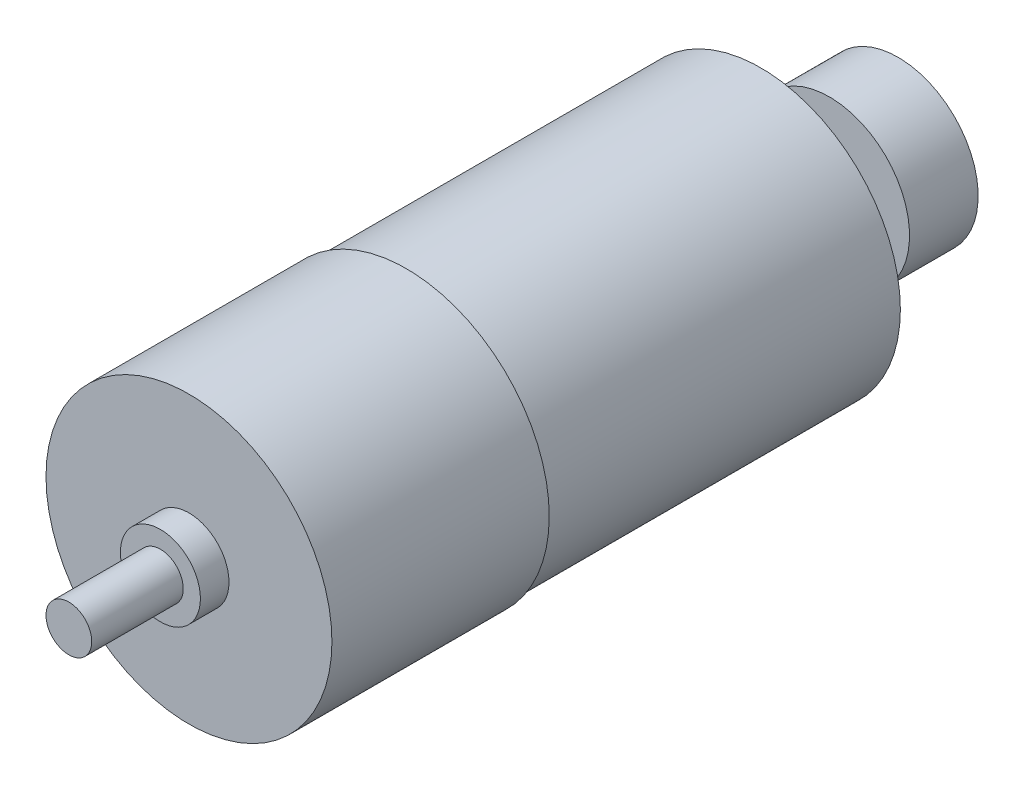
ISO-10303-21;
HEADER;
FILE_DESCRIPTION(('STEP AP214'),'2;1');
FILE_NAME('part.step','',(''),(''),'','','');
FILE_SCHEMA(('AUTOMOTIVE_DESIGN { 1 0 10303 214 1 1 1 1 }'));
ENDSEC;
DATA;
#1=APPLICATION_CONTEXT('core data for automotive mechanical design processes');
#2=APPLICATION_PROTOCOL_DEFINITION('international standard','automotive_design',2000,#1);
#3=PRODUCT_CONTEXT('',#1,'mechanical');
#4=PRODUCT('Part','Part','',(#3));
#5=PRODUCT_RELATED_PRODUCT_CATEGORY('part','',(#4));
#6=PRODUCT_DEFINITION_FORMATION('','',#4);
#7=PRODUCT_DEFINITION_CONTEXT('part definition',#1,'design');
#8=PRODUCT_DEFINITION('design','',#6,#7);
#9=PRODUCT_DEFINITION_SHAPE('','',#8);
#10=(LENGTH_UNIT() NAMED_UNIT(*) SI_UNIT(.MILLI.,.METRE.));
#11=(NAMED_UNIT(*) PLANE_ANGLE_UNIT() SI_UNIT($,.RADIAN.));
#12=(NAMED_UNIT(*) SI_UNIT($,.STERADIAN.) SOLID_ANGLE_UNIT());
#13=UNCERTAINTY_MEASURE_WITH_UNIT(LENGTH_MEASURE(1.E-05),#10,'distance_accuracy_value','');
#14=(GEOMETRIC_REPRESENTATION_CONTEXT(3) GLOBAL_UNCERTAINTY_ASSIGNED_CONTEXT((#13)) GLOBAL_UNIT_ASSIGNED_CONTEXT((#10,
#11,#12)) REPRESENTATION_CONTEXT('',''));
#15=CARTESIAN_POINT('',(0.,0.,0.));
#16=DIRECTION('',(0.,0.,1.));
#17=DIRECTION('',(1.,0.,0.));
#18=AXIS2_PLACEMENT_3D('',#15,#16,#17);
#19=CARTESIAN_POINT('',(0.,0.,19.));
#20=DIRECTION('',(0.,0.,-1.));
#21=DIRECTION('',(-1.,0.,0.));
#22=AXIS2_PLACEMENT_3D('',#19,#20,#21);
#23=CYLINDRICAL_SURFACE('',#22,12.5);
#24=CARTESIAN_POINT('',(0.,0.,19.));
#25=DIRECTION('',(0.,0.,1.));
#26=DIRECTION('',(1.,0.,0.));
#27=AXIS2_PLACEMENT_3D('',#24,#25,#26);
#28=CIRCLE('',#27,12.5);
#29=CARTESIAN_POINT('',(12.5,0.,19.));
#30=VERTEX_POINT('',#29);
#31=EDGE_CURVE('E68',#30,#30,#28,.T.);
#32=ORIENTED_EDGE('',*,*,#31,.F.);
#33=EDGE_LOOP('',(#32));
#34=FACE_BOUND('',#33,.T.);
#35=CARTESIAN_POINT('',(0.,0.,0.));
#36=DIRECTION('',(0.,0.,1.));
#37=DIRECTION('',(1.,0.,0.));
#38=AXIS2_PLACEMENT_3D('',#35,#36,#37);
#39=CIRCLE('',#38,12.5);
#40=CARTESIAN_POINT('',(12.5,0.,0.));
#41=VERTEX_POINT('',#40);
#42=EDGE_CURVE('E40',#41,#41,#39,.T.);
#43=ORIENTED_EDGE('',*,*,#42,.T.);
#44=EDGE_LOOP('',(#43));
#45=FACE_BOUND('',#44,.T.);
#46=ADVANCED_FACE('F37',(#34,#45),#23,.T.);
#47=CARTESIAN_POINT('',(0.,0.,19.));
#48=DIRECTION('',(0.,0.,1.));
#49=DIRECTION('',(1.,0.,0.));
#50=AXIS2_PLACEMENT_3D('',#47,#48,#49);
#51=PLANE('',#50);
#52=CARTESIAN_POINT('',(0.,0.,19.));
#53=DIRECTION('',(0.,0.,1.));
#54=DIRECTION('',(1.,0.,0.));
#55=AXIS2_PLACEMENT_3D('',#52,#53,#54);
#56=CIRCLE('',#55,3.5);
#57=CARTESIAN_POINT('',(3.5,0.,19.));
#58=VERTEX_POINT('',#57);
#59=EDGE_CURVE('E64',#58,#58,#56,.T.);
#60=ORIENTED_EDGE('',*,*,#59,.F.);
#61=EDGE_LOOP('',(#60));
#62=FACE_BOUND('',#61,.T.);
#63=ORIENTED_EDGE('',*,*,#31,.T.);
#64=EDGE_LOOP('',(#63));
#65=FACE_BOUND('',#64,.T.);
#66=ADVANCED_FACE('F79',(#62,#65),#51,.T.);
#67=CARTESIAN_POINT('',(0.,0.,0.));
#68=DIRECTION('',(0.,0.,1.));
#69=DIRECTION('',(1.,0.,0.));
#70=AXIS2_PLACEMENT_3D('',#67,#68,#69);
#71=PLANE('',#70);
#72=CARTESIAN_POINT('',(0.,0.,0.));
#73=DIRECTION('',(0.,0.,-1.));
#74=DIRECTION('',(-1.,0.,0.));
#75=AXIS2_PLACEMENT_3D('',#72,#73,#74);
#76=CIRCLE('',#75,12.2);
#77=CARTESIAN_POINT('',(-12.2,0.,0.));
#78=VERTEX_POINT('',#77);
#79=EDGE_CURVE('E44',#78,#78,#76,.T.);
#80=ORIENTED_EDGE('',*,*,#79,.F.);
#81=EDGE_LOOP('',(#80));
#82=FACE_BOUND('',#81,.T.);
#83=ORIENTED_EDGE('',*,*,#42,.F.);
#84=EDGE_LOOP('',(#83));
#85=FACE_BOUND('',#84,.T.);
#86=ADVANCED_FACE('F76',(#82,#85),#71,.F.);
#87=CARTESIAN_POINT('',(0.,0.,21.5));
#88=DIRECTION('',(0.,0.,-1.));
#89=DIRECTION('',(-1.,0.,0.));
#90=AXIS2_PLACEMENT_3D('',#87,#88,#89);
#91=CYLINDRICAL_SURFACE('',#90,3.5);
#92=CARTESIAN_POINT('',(0.,0.,21.5));
#93=DIRECTION('',(0.,0.,1.));
#94=DIRECTION('',(1.,0.,0.));
#95=AXIS2_PLACEMENT_3D('',#92,#93,#94);
#96=CIRCLE('',#95,3.5);
#97=CARTESIAN_POINT('',(3.5,0.,21.5));
#98=VERTEX_POINT('',#97);
#99=EDGE_CURVE('E61',#98,#98,#96,.T.);
#100=ORIENTED_EDGE('',*,*,#99,.F.);
#101=EDGE_LOOP('',(#100));
#102=FACE_BOUND('',#101,.T.);
#103=ORIENTED_EDGE('',*,*,#59,.T.);
#104=EDGE_LOOP('',(#103));
#105=FACE_BOUND('',#104,.T.);
#106=ADVANCED_FACE('F78',(#102,#105),#91,.T.);
#107=CARTESIAN_POINT('',(0.,0.,21.5));
#108=DIRECTION('',(0.,0.,1.));
#109=DIRECTION('',(1.,0.,0.));
#110=AXIS2_PLACEMENT_3D('',#107,#108,#109);
#111=PLANE('',#110);
#112=CARTESIAN_POINT('',(0.,0.,21.5));
#113=DIRECTION('',(0.,0.,1.));
#114=DIRECTION('',(1.,0.,0.));
#115=AXIS2_PLACEMENT_3D('',#112,#113,#114);
#116=CIRCLE('',#115,2.);
#117=CARTESIAN_POINT('',(2.,0.,21.5));
#118=VERTEX_POINT('',#117);
#119=EDGE_CURVE('E49',#118,#118,#116,.T.);
#120=ORIENTED_EDGE('',*,*,#119,.F.);
#121=EDGE_LOOP('',(#120));
#122=FACE_BOUND('',#121,.T.);
#123=ORIENTED_EDGE('',*,*,#99,.T.);
#124=EDGE_LOOP('',(#123));
#125=FACE_BOUND('',#124,.T.);
#126=ADVANCED_FACE('F86',(#122,#125),#111,.T.);
#127=CARTESIAN_POINT('',(0.,0.,29.5));
#128=DIRECTION('',(0.,0.,-1.));
#129=DIRECTION('',(-1.,0.,0.));
#130=AXIS2_PLACEMENT_3D('',#127,#128,#129);
#131=CYLINDRICAL_SURFACE('',#130,2.);
#132=CARTESIAN_POINT('',(0.,0.,29.5));
#133=DIRECTION('',(0.,0.,1.));
#134=DIRECTION('',(1.,0.,0.));
#135=AXIS2_PLACEMENT_3D('',#132,#133,#134);
#136=CIRCLE('',#135,2.);
#137=CARTESIAN_POINT('',(2.,0.,29.5));
#138=VERTEX_POINT('',#137);
#139=EDGE_CURVE('E57',#138,#138,#136,.T.);
#140=ORIENTED_EDGE('',*,*,#139,.F.);
#141=EDGE_LOOP('',(#140));
#142=FACE_BOUND('',#141,.T.);
#143=ORIENTED_EDGE('',*,*,#119,.T.);
#144=EDGE_LOOP('',(#143));
#145=FACE_BOUND('',#144,.T.);
#146=ADVANCED_FACE('F114',(#142,#145),#131,.T.);
#147=CARTESIAN_POINT('',(0.,0.,29.5));
#148=DIRECTION('',(0.,0.,1.));
#149=DIRECTION('',(1.,0.,0.));
#150=AXIS2_PLACEMENT_3D('',#147,#148,#149);
#151=PLANE('',#150);
#152=ORIENTED_EDGE('',*,*,#139,.T.);
#153=EDGE_LOOP('',(#152));
#154=FACE_BOUND('',#153,.T.);
#155=ADVANCED_FACE('F122',(#154),#151,.T.);
#156=CARTESIAN_POINT('',(0.,0.,-31.));
#157=DIRECTION('',(0.,0.,1.));
#158=DIRECTION('',(1.,0.,0.));
#159=AXIS2_PLACEMENT_3D('',#156,#157,#158);
#160=CYLINDRICAL_SURFACE('',#159,12.2);
#161=CARTESIAN_POINT('',(0.,0.,-31.));
#162=DIRECTION('',(0.,0.,-1.));
#163=DIRECTION('',(-1.,0.,0.));
#164=AXIS2_PLACEMENT_3D('',#161,#162,#163);
#165=CIRCLE('',#164,12.2);
#166=CARTESIAN_POINT('',(-12.2,0.,-31.));
#167=VERTEX_POINT('',#166);
#168=EDGE_CURVE('E55',#167,#167,#165,.T.);
#169=ORIENTED_EDGE('',*,*,#168,.F.);
#170=EDGE_LOOP('',(#169));
#171=FACE_BOUND('',#170,.T.);
#172=ORIENTED_EDGE('',*,*,#79,.T.);
#173=EDGE_LOOP('',(#172));
#174=FACE_BOUND('',#173,.T.);
#175=ADVANCED_FACE('F130',(#171,#174),#160,.T.);
#176=CARTESIAN_POINT('',(0.,0.,-31.));
#177=DIRECTION('',(0.,0.,-1.));
#178=DIRECTION('',(-1.,0.,0.));
#179=AXIS2_PLACEMENT_3D('',#176,#177,#178);
#180=PLANE('',#179);
#181=CARTESIAN_POINT('',(0.,0.,-31.));
#182=DIRECTION('',(0.,0.,-1.));
#183=DIRECTION('',(-1.,0.,0.));
#184=AXIS2_PLACEMENT_3D('',#181,#182,#183);
#185=CIRCLE('',#184,2.);
#186=CARTESIAN_POINT('',(-2.,0.,-31.));
#187=VERTEX_POINT('',#186);
#188=EDGE_CURVE('E10',#187,#187,#185,.T.);
#189=ORIENTED_EDGE('',*,*,#188,.F.);
#190=EDGE_LOOP('',(#189));
#191=FACE_BOUND('',#190,.T.);
#192=ORIENTED_EDGE('',*,*,#168,.T.);
#193=EDGE_LOOP('',(#192));
#194=FACE_BOUND('',#193,.T.);
#195=ADVANCED_FACE('F142',(#191,#194),#180,.T.);
#196=CARTESIAN_POINT('',(0.,0.,-37.));
#197=DIRECTION('',(0.,0.,1.));
#198=DIRECTION('',(1.,0.,0.));
#199=AXIS2_PLACEMENT_3D('',#196,#197,#198);
#200=CYLINDRICAL_SURFACE('',#199,2.);
#201=CARTESIAN_POINT('',(0.,0.,-37.));
#202=DIRECTION('',(0.,0.,-1.));
#203=DIRECTION('',(-1.,0.,0.));
#204=AXIS2_PLACEMENT_3D('',#201,#202,#203);
#205=CIRCLE('',#204,2.);
#206=CARTESIAN_POINT('',(-2.,0.,-37.));
#207=VERTEX_POINT('',#206);
#208=EDGE_CURVE('E53',#207,#207,#205,.T.);
#209=ORIENTED_EDGE('',*,*,#208,.F.);
#210=EDGE_LOOP('',(#209));
#211=FACE_BOUND('',#210,.T.);
#212=ORIENTED_EDGE('',*,*,#188,.T.);
#213=EDGE_LOOP('',(#212));
#214=FACE_BOUND('',#213,.T.);
#215=ADVANCED_FACE('F152',(#211,#214),#200,.T.);
#216=CARTESIAN_POINT('',(0.,0.,-43.));
#217=DIRECTION('',(0.,0.,1.));
#218=DIRECTION('',(1.,0.,0.));
#219=AXIS2_PLACEMENT_3D('',#216,#217,#218);
#220=CYLINDRICAL_SURFACE('',#219,7.);
#221=CARTESIAN_POINT('',(0.,0.,-43.));
#222=DIRECTION('',(0.,0.,-1.));
#223=DIRECTION('',(-1.,0.,0.));
#224=AXIS2_PLACEMENT_3D('',#221,#222,#223);
#225=CIRCLE('',#224,7.);
#226=CARTESIAN_POINT('',(-7.,0.,-43.));
#227=VERTEX_POINT('',#226);
#228=EDGE_CURVE('E202',#227,#227,#225,.T.);
#229=ORIENTED_EDGE('',*,*,#228,.F.);
#230=EDGE_LOOP('',(#229));
#231=FACE_BOUND('',#230,.T.);
#232=CARTESIAN_POINT('',(0.,0.,-37.));
#233=DIRECTION('',(0.,0.,-1.));
#234=DIRECTION('',(-1.,0.,0.));
#235=AXIS2_PLACEMENT_3D('',#232,#233,#234);
#236=CIRCLE('',#235,7.);
#237=CARTESIAN_POINT('',(-7.,0.,-37.));
#238=VERTEX_POINT('',#237);
#239=EDGE_CURVE('E200',#238,#238,#236,.T.);
#240=ORIENTED_EDGE('',*,*,#239,.T.);
#241=EDGE_LOOP('',(#240));
#242=FACE_BOUND('',#241,.T.);
#243=ADVANCED_FACE('F162',(#231,#242),#220,.T.);
#244=CARTESIAN_POINT('',(0.,0.,-43.));
#245=DIRECTION('',(0.,0.,-1.));
#246=DIRECTION('',(-1.,0.,0.));
#247=AXIS2_PLACEMENT_3D('',#244,#245,#246);
#248=PLANE('',#247);
#249=ORIENTED_EDGE('',*,*,#228,.T.);
#250=EDGE_LOOP('',(#249));
#251=FACE_BOUND('',#250,.T.);
#252=ADVANCED_FACE('F172',(#251),#248,.T.);
#253=CARTESIAN_POINT('',(0.,0.,-37.));
#254=DIRECTION('',(0.,0.,-1.));
#255=DIRECTION('',(-1.,0.,0.));
#256=AXIS2_PLACEMENT_3D('',#253,#254,#255);
#257=PLANE('',#256);
#258=ORIENTED_EDGE('',*,*,#208,.T.);
#259=EDGE_LOOP('',(#258));
#260=FACE_BOUND('',#259,.T.);
#261=ORIENTED_EDGE('',*,*,#239,.F.);
#262=EDGE_LOOP('',(#261));
#263=FACE_BOUND('',#262,.T.);
#264=ADVANCED_FACE('F182',(#260,#263),#257,.F.);
#265=CLOSED_SHELL('',(#46,#66,#86,#106,#126,#146,#155,#175,#195,#215,#243,#252,#264));
#266=MANIFOLD_SOLID_BREP('B2',#265);
#267=ADVANCED_BREP_SHAPE_REPRESENTATION('',(#18,#266),#14);
#268=SHAPE_DEFINITION_REPRESENTATION(#9,#267);
ENDSEC;
END-ISO-10303-21;
